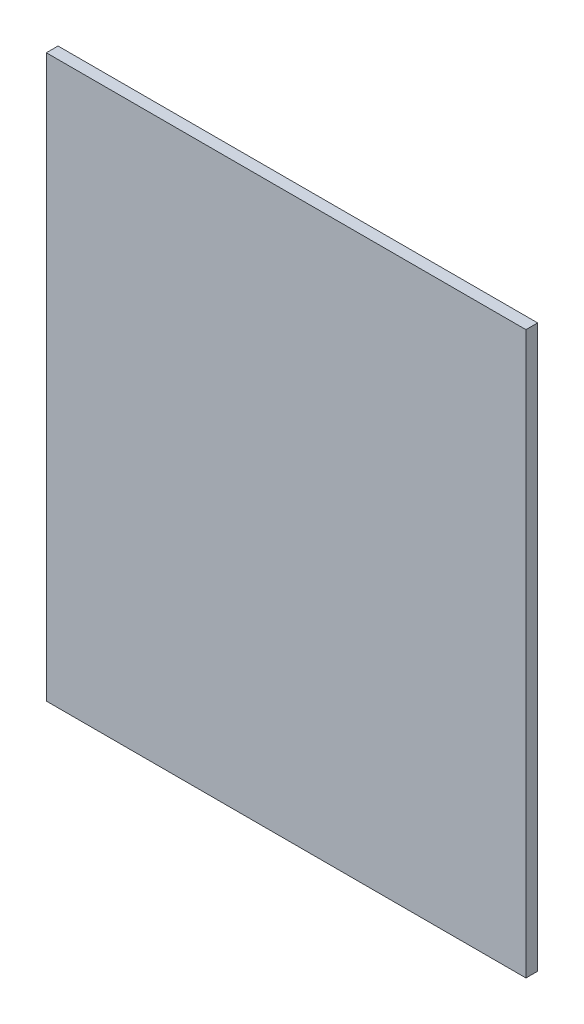
ISO-10303-21;
HEADER;
FILE_DESCRIPTION(('STEP AP214'),'2;1');
FILE_NAME('part.step','',(''),(''),'','','');
FILE_SCHEMA(('AUTOMOTIVE_DESIGN { 1 0 10303 214 1 1 1 1 }'));
ENDSEC;
DATA;
#1=APPLICATION_CONTEXT('core data for automotive mechanical design processes');
#2=APPLICATION_PROTOCOL_DEFINITION('international standard','automotive_design',2000,#1);
#3=PRODUCT_CONTEXT('',#1,'mechanical');
#4=PRODUCT('Part','Part','',(#3));
#5=PRODUCT_RELATED_PRODUCT_CATEGORY('part','',(#4));
#6=PRODUCT_DEFINITION_FORMATION('','',#4);
#7=PRODUCT_DEFINITION_CONTEXT('part definition',#1,'design');
#8=PRODUCT_DEFINITION('design','',#6,#7);
#9=PRODUCT_DEFINITION_SHAPE('','',#8);
#10=(LENGTH_UNIT() NAMED_UNIT(*) SI_UNIT(.MILLI.,.METRE.));
#11=(NAMED_UNIT(*) PLANE_ANGLE_UNIT() SI_UNIT($,.RADIAN.));
#12=(NAMED_UNIT(*) SI_UNIT($,.STERADIAN.) SOLID_ANGLE_UNIT());
#13=UNCERTAINTY_MEASURE_WITH_UNIT(LENGTH_MEASURE(1.E-05),#10,'distance_accuracy_value','');
#14=(GEOMETRIC_REPRESENTATION_CONTEXT(3) GLOBAL_UNCERTAINTY_ASSIGNED_CONTEXT((#13)) GLOBAL_UNIT_ASSIGNED_CONTEXT((#10,
#11,#12)) REPRESENTATION_CONTEXT('',''));
#15=CARTESIAN_POINT('',(0.,0.,0.));
#16=DIRECTION('',(0.,0.,1.));
#17=DIRECTION('',(1.,0.,0.));
#18=AXIS2_PLACEMENT_3D('',#15,#16,#17);
#19=CARTESIAN_POINT('',(-19.050000000002,-285.75,6.35));
#20=DIRECTION('',(-1.,0.,0.));
#21=DIRECTION('',(0.,0.,1.));
#22=AXIS2_PLACEMENT_3D('',#19,#20,#21);
#23=PLANE('',#22);
#24=DIRECTION('',(0.,1.,0.));
#25=VECTOR('',#24,1.);
#26=CARTESIAN_POINT('',(-19.050000000002,-285.75,0.));
#27=LINE('',#26,#25);
#28=CARTESIAN_POINT('',(-19.050000000002,-285.75,0.));
#29=VERTEX_POINT('',#28);
#30=CARTESIAN_POINT('',(-19.050000000002,19.0500000000016,0.));
#31=VERTEX_POINT('',#30);
#32=EDGE_CURVE('E104',#29,#31,#27,.T.);
#33=ORIENTED_EDGE('',*,*,#32,.F.);
#34=DIRECTION('',(0.,0.,-1.));
#35=VECTOR('',#34,1.);
#36=CARTESIAN_POINT('',(-19.050000000002,-285.75,6.35));
#37=LINE('',#36,#35);
#38=CARTESIAN_POINT('',(-19.050000000002,-285.75,6.35));
#39=VERTEX_POINT('',#38);
#40=EDGE_CURVE('E11',#39,#29,#37,.T.);
#41=ORIENTED_EDGE('',*,*,#40,.F.);
#42=DIRECTION('',(0.,1.,0.));
#43=VECTOR('',#42,1.);
#44=CARTESIAN_POINT('',(-19.050000000002,-285.75,6.35));
#45=LINE('',#44,#43);
#46=CARTESIAN_POINT('',(-19.050000000002,19.0500000000016,6.35));
#47=VERTEX_POINT('',#46);
#48=EDGE_CURVE('E99',#39,#47,#45,.T.);
#49=ORIENTED_EDGE('',*,*,#48,.T.);
#50=DIRECTION('',(0.,0.,-1.));
#51=VECTOR('',#50,1.);
#52=CARTESIAN_POINT('',(-19.050000000002,19.0500000000016,6.35));
#53=LINE('',#52,#51);
#54=EDGE_CURVE('E42',#47,#31,#53,.T.);
#55=ORIENTED_EDGE('',*,*,#54,.T.);
#56=EDGE_LOOP('',(#33,#41,#49,#55));
#57=FACE_BOUND('',#56,.T.);
#58=ADVANCED_FACE('F39',(#57),#23,.T.);
#59=CARTESIAN_POINT('',(-19.050000000002,-285.75,6.35));
#60=DIRECTION('',(0.,1.,0.));
#61=DIRECTION('',(0.,0.,1.));
#62=AXIS2_PLACEMENT_3D('',#59,#60,#61);
#63=PLANE('',#62);
#64=DIRECTION('',(1.,0.,0.));
#65=VECTOR('',#64,1.);
#66=CARTESIAN_POINT('',(-19.050000000002,-285.75,0.));
#67=LINE('',#66,#65);
#68=CARTESIAN_POINT('',(241.3,-285.75,0.));
#69=VERTEX_POINT('',#68);
#70=EDGE_CURVE('E72',#29,#69,#67,.T.);
#71=ORIENTED_EDGE('',*,*,#70,.T.);
#72=DIRECTION('',(0.,0.,-1.));
#73=VECTOR('',#72,1.);
#74=CARTESIAN_POINT('',(241.3,-285.75,6.35));
#75=LINE('',#74,#73);
#76=CARTESIAN_POINT('',(241.3,-285.75,6.35));
#77=VERTEX_POINT('',#76);
#78=EDGE_CURVE('E48',#77,#69,#75,.T.);
#79=ORIENTED_EDGE('',*,*,#78,.F.);
#80=DIRECTION('',(1.,0.,0.));
#81=VECTOR('',#80,1.);
#82=CARTESIAN_POINT('',(-19.050000000002,-285.75,6.35));
#83=LINE('',#82,#81);
#84=EDGE_CURVE('E89',#39,#77,#83,.T.);
#85=ORIENTED_EDGE('',*,*,#84,.F.);
#86=ORIENTED_EDGE('',*,*,#40,.T.);
#87=EDGE_LOOP('',(#71,#79,#85,#86));
#88=FACE_BOUND('',#87,.T.);
#89=ADVANCED_FACE('F114',(#88),#63,.F.);
#90=CARTESIAN_POINT('',(241.3,-285.75,6.35));
#91=DIRECTION('',(-1.,0.,0.));
#92=DIRECTION('',(0.,0.,1.));
#93=AXIS2_PLACEMENT_3D('',#90,#91,#92);
#94=PLANE('',#93);
#95=DIRECTION('',(0.,1.,0.));
#96=VECTOR('',#95,1.);
#97=CARTESIAN_POINT('',(241.3,-285.75,0.));
#98=LINE('',#97,#96);
#99=CARTESIAN_POINT('',(241.3,19.0500000000016,0.));
#100=VERTEX_POINT('',#99);
#101=EDGE_CURVE('E96',#69,#100,#98,.T.);
#102=ORIENTED_EDGE('',*,*,#101,.T.);
#103=DIRECTION('',(0.,0.,-1.));
#104=VECTOR('',#103,1.);
#105=CARTESIAN_POINT('',(241.3,19.0500000000016,6.35));
#106=LINE('',#105,#104);
#107=CARTESIAN_POINT('',(241.3,19.0500000000016,6.35));
#108=VERTEX_POINT('',#107);
#109=EDGE_CURVE('E93',#108,#100,#106,.T.);
#110=ORIENTED_EDGE('',*,*,#109,.F.);
#111=DIRECTION('',(0.,1.,0.));
#112=VECTOR('',#111,1.);
#113=CARTESIAN_POINT('',(241.3,-285.75,6.35));
#114=LINE('',#113,#112);
#115=EDGE_CURVE('E84',#77,#108,#114,.T.);
#116=ORIENTED_EDGE('',*,*,#115,.F.);
#117=ORIENTED_EDGE('',*,*,#78,.T.);
#118=EDGE_LOOP('',(#102,#110,#116,#117));
#119=FACE_BOUND('',#118,.T.);
#120=ADVANCED_FACE('F94',(#119),#94,.F.);
#121=CARTESIAN_POINT('',(-19.050000000002,19.0500000000016,6.35));
#122=DIRECTION('',(0.,1.,0.));
#123=DIRECTION('',(0.,0.,1.));
#124=AXIS2_PLACEMENT_3D('',#121,#122,#123);
#125=PLANE('',#124);
#126=DIRECTION('',(1.,0.,0.));
#127=VECTOR('',#126,1.);
#128=CARTESIAN_POINT('',(-19.050000000002,19.0500000000016,0.));
#129=LINE('',#128,#127);
#130=EDGE_CURVE('E107',#31,#100,#129,.T.);
#131=ORIENTED_EDGE('',*,*,#130,.F.);
#132=ORIENTED_EDGE('',*,*,#54,.F.);
#133=DIRECTION('',(1.,0.,0.));
#134=VECTOR('',#133,1.);
#135=CARTESIAN_POINT('',(-19.050000000002,19.0500000000016,6.35));
#136=LINE('',#135,#134);
#137=EDGE_CURVE('E88',#47,#108,#136,.T.);
#138=ORIENTED_EDGE('',*,*,#137,.T.);
#139=ORIENTED_EDGE('',*,*,#109,.T.);
#140=EDGE_LOOP('',(#131,#132,#138,#139));
#141=FACE_BOUND('',#140,.T.);
#142=ADVANCED_FACE('F98',(#141),#125,.T.);
#143=CARTESIAN_POINT('',(0.,0.,6.35));
#144=DIRECTION('',(0.,0.,-1.));
#145=DIRECTION('',(-1.,0.,0.));
#146=AXIS2_PLACEMENT_3D('',#143,#144,#145);
#147=PLANE('',#146);
#148=ORIENTED_EDGE('',*,*,#48,.F.);
#149=ORIENTED_EDGE('',*,*,#84,.T.);
#150=ORIENTED_EDGE('',*,*,#115,.T.);
#151=ORIENTED_EDGE('',*,*,#137,.F.);
#152=EDGE_LOOP('',(#148,#149,#150,#151));
#153=FACE_BOUND('',#152,.T.);
#154=ADVANCED_FACE('F87',(#153),#147,.F.);
#155=CARTESIAN_POINT('',(0.,0.,0.));
#156=DIRECTION('',(0.,0.,-1.));
#157=DIRECTION('',(-1.,0.,0.));
#158=AXIS2_PLACEMENT_3D('',#155,#156,#157);
#159=PLANE('',#158);
#160=ORIENTED_EDGE('',*,*,#32,.T.);
#161=ORIENTED_EDGE('',*,*,#130,.T.);
#162=ORIENTED_EDGE('',*,*,#101,.F.);
#163=ORIENTED_EDGE('',*,*,#70,.F.);
#164=EDGE_LOOP('',(#160,#161,#162,#163));
#165=FACE_BOUND('',#164,.T.);
#166=ADVANCED_FACE('F112',(#165),#159,.T.);
#167=CLOSED_SHELL('',(#58,#89,#120,#142,#154,#166));
#168=MANIFOLD_SOLID_BREP('B2',#167);
#169=ADVANCED_BREP_SHAPE_REPRESENTATION('',(#18,#168),#14);
#170=SHAPE_DEFINITION_REPRESENTATION(#9,#169);
ENDSEC;
END-ISO-10303-21;
